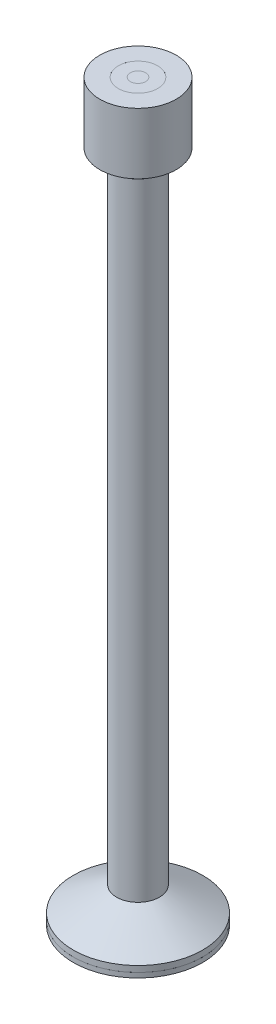
ISO-10303-21;
HEADER;
FILE_DESCRIPTION(('STEP AP214'),'2;1');
FILE_NAME('part.step','',(''),(''),'','','');
FILE_SCHEMA(('AUTOMOTIVE_DESIGN { 1 0 10303 214 1 1 1 1 }'));
ENDSEC;
DATA;
#1=APPLICATION_CONTEXT('core data for automotive mechanical design processes');
#2=APPLICATION_PROTOCOL_DEFINITION('international standard','automotive_design',2000,#1);
#3=PRODUCT_CONTEXT('',#1,'mechanical');
#4=PRODUCT('Part','Part','',(#3));
#5=PRODUCT_RELATED_PRODUCT_CATEGORY('part','',(#4));
#6=PRODUCT_DEFINITION_FORMATION('','',#4);
#7=PRODUCT_DEFINITION_CONTEXT('part definition',#1,'design');
#8=PRODUCT_DEFINITION('design','',#6,#7);
#9=PRODUCT_DEFINITION_SHAPE('','',#8);
#10=(LENGTH_UNIT() NAMED_UNIT(*) SI_UNIT(.MILLI.,.METRE.));
#11=(NAMED_UNIT(*) PLANE_ANGLE_UNIT() SI_UNIT($,.RADIAN.));
#12=(NAMED_UNIT(*) SI_UNIT($,.STERADIAN.) SOLID_ANGLE_UNIT());
#13=UNCERTAINTY_MEASURE_WITH_UNIT(LENGTH_MEASURE(1.E-05),#10,'distance_accuracy_value','');
#14=(GEOMETRIC_REPRESENTATION_CONTEXT(3) GLOBAL_UNCERTAINTY_ASSIGNED_CONTEXT((#13)) GLOBAL_UNIT_ASSIGNED_CONTEXT((#10,
#11,#12)) REPRESENTATION_CONTEXT('',''));
#15=CARTESIAN_POINT('',(0.,0.,0.));
#16=DIRECTION('',(0.,0.,1.));
#17=DIRECTION('',(1.,0.,0.));
#18=AXIS2_PLACEMENT_3D('',#15,#16,#17);
#19=CARTESIAN_POINT('',(1.37500000000001,0.100000000000002,0.));
#20=DIRECTION('',(0.,1.,0.));
#21=DIRECTION('',(0.,0.,1.));
#22=AXIS2_PLACEMENT_3D('',#19,#20,#21);
#23=PLANE('',#22);
#24=CARTESIAN_POINT('',(0.,0.100000000000002,0.));
#25=DIRECTION('',(0.,1.,0.));
#26=DIRECTION('',(0.,0.,1.));
#27=AXIS2_PLACEMENT_3D('',#24,#25,#26);
#28=CIRCLE('',#27,1.37500000000001);
#29=CARTESIAN_POINT('',(0.,0.100000000000002,1.37500000000001));
#30=VERTEX_POINT('',#29);
#31=EDGE_CURVE('E11',#30,#30,#28,.F.);
#32=ORIENTED_EDGE('',*,*,#31,.F.);
#33=EDGE_LOOP('',(#32));
#34=FACE_BOUND('',#33,.T.);
#35=ADVANCED_FACE('F42',(#34),#23,.T.);
#36=CARTESIAN_POINT('',(0.,3.98908729652604,0.));
#37=DIRECTION('',(0.,-1.,0.));
#38=DIRECTION('',(1.,0.,0.));
#39=AXIS2_PLACEMENT_3D('',#36,#37,#38);
#40=CYLINDRICAL_SURFACE('',#39,1.37500000000001);
#41=CARTESIAN_POINT('',(0.,0.,0.));
#42=DIRECTION('',(0.,-1.,0.));
#43=DIRECTION('',(1.,0.,0.));
#44=AXIS2_PLACEMENT_3D('',#41,#42,#43);
#45=CIRCLE('',#44,1.37500000000001);
#46=CARTESIAN_POINT('',(1.37500000000001,0.,0.));
#47=VERTEX_POINT('',#46);
#48=EDGE_CURVE('E48',#47,#47,#45,.T.);
#49=ORIENTED_EDGE('',*,*,#48,.F.);
#50=EDGE_LOOP('',(#49));
#51=FACE_BOUND('',#50,.T.);
#52=ORIENTED_EDGE('',*,*,#31,.T.);
#53=EDGE_LOOP('',(#52));
#54=FACE_BOUND('',#53,.T.);
#55=ADVANCED_FACE('F75',(#51,#54),#40,.T.);
#56=CARTESIAN_POINT('',(0.,-0.4,0.));
#57=DIRECTION('',(0.,1.,0.));
#58=DIRECTION('',(-1.,0.,0.));
#59=AXIS2_PLACEMENT_3D('',#56,#57,#58);
#60=CYLINDRICAL_SURFACE('',#59,5.37499999999999);
#61=CARTESIAN_POINT('',(0.,-0.4,0.));
#62=DIRECTION('',(0.,-1.,0.));
#63=DIRECTION('',(1.,0.,0.));
#64=AXIS2_PLACEMENT_3D('',#61,#62,#63);
#65=CIRCLE('',#64,5.37499999999999);
#66=CARTESIAN_POINT('',(5.375,-0.4,0.));
#67=VERTEX_POINT('',#66);
#68=EDGE_CURVE('E52',#67,#67,#65,.T.);
#69=ORIENTED_EDGE('',*,*,#68,.F.);
#70=EDGE_LOOP('',(#69));
#71=FACE_BOUND('',#70,.T.);
#72=CARTESIAN_POINT('',(0.,0.,0.));
#73=DIRECTION('',(0.,-1.,0.));
#74=DIRECTION('',(1.,0.,0.));
#75=AXIS2_PLACEMENT_3D('',#72,#73,#74);
#76=CIRCLE('',#75,5.37499999999999);
#77=CARTESIAN_POINT('',(5.375,0.,0.));
#78=VERTEX_POINT('',#77);
#79=EDGE_CURVE('E56',#78,#78,#76,.T.);
#80=ORIENTED_EDGE('',*,*,#79,.T.);
#81=EDGE_LOOP('',(#80));
#82=FACE_BOUND('',#81,.T.);
#83=ADVANCED_FACE('F62',(#71,#82),#60,.T.);
#84=CARTESIAN_POINT('',(0.,-0.4,0.));
#85=DIRECTION('',(0.,-1.,0.));
#86=DIRECTION('',(1.,0.,0.));
#87=AXIS2_PLACEMENT_3D('',#84,#85,#86);
#88=PLANE('',#87);
#89=ORIENTED_EDGE('',*,*,#68,.T.);
#90=EDGE_LOOP('',(#89));
#91=FACE_BOUND('',#90,.T.);
#92=ADVANCED_FACE('F66',(#91),#88,.T.);
#93=CARTESIAN_POINT('',(0.,0.,0.));
#94=DIRECTION('',(0.,-1.,0.));
#95=DIRECTION('',(1.,0.,0.));
#96=AXIS2_PLACEMENT_3D('',#93,#94,#95);
#97=PLANE('',#96);
#98=ORIENTED_EDGE('',*,*,#48,.T.);
#99=EDGE_LOOP('',(#98));
#100=FACE_BOUND('',#99,.T.);
#101=ORIENTED_EDGE('',*,*,#79,.F.);
#102=EDGE_LOOP('',(#101));
#103=FACE_BOUND('',#102,.T.);
#104=ADVANCED_FACE('F64',(#100,#103),#97,.F.);
#105=CLOSED_SHELL('',(#35,#55,#83,#92,#104));
#106=MANIFOLD_SOLID_BREP('B2',#105);
#107=CARTESIAN_POINT('',(0.,55.5,0.));
#108=DIRECTION('',(0.,1.,0.));
#109=DIRECTION('',(0.,0.,1.));
#110=AXIS2_PLACEMENT_3D('',#107,#108,#109);
#111=CYLINDRICAL_SURFACE('',#110,0.375);
#112=CARTESIAN_POINT('',(0.,0.100000000000003,0.));
#113=DIRECTION('',(0.,1.,0.));
#114=DIRECTION('',(0.,0.,1.));
#115=AXIS2_PLACEMENT_3D('',#112,#113,#114);
#116=CIRCLE('',#115,0.375);
#117=CARTESIAN_POINT('',(0.,0.100000000000003,0.375));
#118=VERTEX_POINT('',#117);
#119=EDGE_CURVE('E142',#118,#118,#116,.T.);
#120=ORIENTED_EDGE('',*,*,#119,.F.);
#121=EDGE_LOOP('',(#120));
#122=FACE_BOUND('',#121,.T.);
#123=CARTESIAN_POINT('',(0.,54.9421933085502,0.));
#124=DIRECTION('',(0.,1.,0.));
#125=DIRECTION('',(0.,0.,1.));
#126=AXIS2_PLACEMENT_3D('',#123,#124,#125);
#127=CIRCLE('',#126,0.375);
#128=CARTESIAN_POINT('',(0.,54.9421933085502,0.375));
#129=VERTEX_POINT('',#128);
#130=EDGE_CURVE('E41',#129,#129,#127,.T.);
#131=ORIENTED_EDGE('',*,*,#130,.T.);
#132=EDGE_LOOP('',(#131));
#133=FACE_BOUND('',#132,.T.);
#134=ADVANCED_FACE('F120',(#122,#133),#111,.F.);
#135=CARTESIAN_POINT('',(0.,60.571,0.));
#136=DIRECTION('',(0.,1.,0.));
#137=DIRECTION('',(0.,0.,1.));
#138=AXIS2_PLACEMENT_3D('',#135,#136,#137);
#139=CONICAL_SURFACE('',#138,0.635000000000092,0.0461581536129454);
#140=ORIENTED_EDGE('',*,*,#130,.F.);
#141=EDGE_LOOP('',(#140));
#142=FACE_BOUND('',#141,.T.);
#143=CARTESIAN_POINT('',(0.,60.571,0.));
#144=DIRECTION('',(0.,1.,0.));
#145=DIRECTION('',(0.,0.,1.));
#146=AXIS2_PLACEMENT_3D('',#143,#144,#145);
#147=CIRCLE('',#146,0.635000000000092);
#148=CARTESIAN_POINT('',(0.,60.571,0.635000000000092));
#149=VERTEX_POINT('',#148);
#150=EDGE_CURVE('E126',#149,#149,#147,.T.);
#151=ORIENTED_EDGE('',*,*,#150,.T.);
#152=EDGE_LOOP('',(#151));
#153=FACE_BOUND('',#152,.T.);
#154=ADVANCED_FACE('F149',(#142,#153),#139,.F.);
#155=CARTESIAN_POINT('',(0.635000000000092,60.571,0.));
#156=DIRECTION('',(0.,-1.,0.));
#157=DIRECTION('',(0.,0.,-1.));
#158=AXIS2_PLACEMENT_3D('',#155,#156,#157);
#159=PLANE('',#158);
#160=ORIENTED_EDGE('',*,*,#150,.F.);
#161=EDGE_LOOP('',(#160));
#162=FACE_BOUND('',#161,.T.);
#163=CARTESIAN_POINT('',(0.,60.571,0.));
#164=DIRECTION('',(0.,1.,0.));
#165=DIRECTION('',(0.,0.,1.));
#166=AXIS2_PLACEMENT_3D('',#163,#164,#165);
#167=CIRCLE('',#166,1.63500000000009);
#168=CARTESIAN_POINT('',(0.,60.571,1.63500000000009));
#169=VERTEX_POINT('',#168);
#170=EDGE_CURVE('E130',#169,#169,#167,.T.);
#171=ORIENTED_EDGE('',*,*,#170,.T.);
#172=EDGE_LOOP('',(#171));
#173=FACE_BOUND('',#172,.T.);
#174=ADVANCED_FACE('F153',(#162,#173),#159,.F.);
#175=CARTESIAN_POINT('',(0.,54.9421933085502,0.));
#176=DIRECTION('',(0.,1.,0.));
#177=DIRECTION('',(0.,0.,1.));
#178=AXIS2_PLACEMENT_3D('',#175,#176,#177);
#179=CONICAL_SURFACE('',#178,1.37500000000001,0.0461581536129434);
#180=ORIENTED_EDGE('',*,*,#170,.F.);
#181=EDGE_LOOP('',(#180));
#182=FACE_BOUND('',#181,.T.);
#183=CARTESIAN_POINT('',(0.,54.9421933085502,0.));
#184=DIRECTION('',(0.,1.,0.));
#185=DIRECTION('',(0.,0.,1.));
#186=AXIS2_PLACEMENT_3D('',#183,#184,#185);
#187=CIRCLE('',#186,1.37500000000001);
#188=CARTESIAN_POINT('',(0.,54.9421933085502,1.37500000000001));
#189=VERTEX_POINT('',#188);
#190=EDGE_CURVE('E134',#189,#189,#187,.T.);
#191=ORIENTED_EDGE('',*,*,#190,.T.);
#192=EDGE_LOOP('',(#191));
#193=FACE_BOUND('',#192,.T.);
#194=ADVANCED_FACE('F158',(#182,#193),#179,.T.);
#195=CARTESIAN_POINT('',(0.,55.5,0.));
#196=DIRECTION('',(0.,1.,0.));
#197=DIRECTION('',(0.,0.,1.));
#198=AXIS2_PLACEMENT_3D('',#195,#196,#197);
#199=CYLINDRICAL_SURFACE('',#198,1.37500000000001);
#200=ORIENTED_EDGE('',*,*,#190,.F.);
#201=EDGE_LOOP('',(#200));
#202=FACE_BOUND('',#201,.T.);
#203=CARTESIAN_POINT('',(0.,0.100000000000003,0.));
#204=DIRECTION('',(0.,1.,0.));
#205=DIRECTION('',(0.,0.,1.));
#206=AXIS2_PLACEMENT_3D('',#203,#204,#205);
#207=CIRCLE('',#206,1.37500000000001);
#208=CARTESIAN_POINT('',(0.,0.100000000000003,1.37500000000001));
#209=VERTEX_POINT('',#208);
#210=EDGE_CURVE('E139',#209,#209,#207,.T.);
#211=ORIENTED_EDGE('',*,*,#210,.T.);
#212=EDGE_LOOP('',(#211));
#213=FACE_BOUND('',#212,.T.);
#214=ADVANCED_FACE('F164',(#202,#213),#199,.T.);
#215=CARTESIAN_POINT('',(1.37500000000001,0.100000000000002,0.));
#216=DIRECTION('',(0.,1.,0.));
#217=DIRECTION('',(0.,0.,1.));
#218=AXIS2_PLACEMENT_3D('',#215,#216,#217);
#219=PLANE('',#218);
#220=ORIENTED_EDGE('',*,*,#210,.F.);
#221=EDGE_LOOP('',(#220));
#222=FACE_BOUND('',#221,.T.);
#223=ORIENTED_EDGE('',*,*,#119,.T.);
#224=EDGE_LOOP('',(#223));
#225=FACE_BOUND('',#224,.T.);
#226=ADVANCED_FACE('F146',(#222,#225),#219,.F.);
#227=CLOSED_SHELL('',(#134,#154,#174,#194,#214,#226));
#228=MANIFOLD_SOLID_BREP('B6',#227);
#229=CARTESIAN_POINT('',(1.37500000000001,0.,0.));
#230=DIRECTION('',(0.,1.,0.));
#231=DIRECTION('',(-1.,0.,0.));
#232=AXIS2_PLACEMENT_3D('',#229,#230,#231);
#233=PLANE('',#232);
#234=CARTESIAN_POINT('',(0.,0.,0.));
#235=DIRECTION('',(0.,1.,0.));
#236=DIRECTION('',(-1.,0.,0.));
#237=AXIS2_PLACEMENT_3D('',#234,#235,#236);
#238=CIRCLE('',#237,5.37499999999999);
#239=CARTESIAN_POINT('',(-5.37499999999999,0.,0.));
#240=VERTEX_POINT('',#239);
#241=EDGE_CURVE('E119',#240,#240,#238,.T.);
#242=ORIENTED_EDGE('',*,*,#241,.F.);
#243=EDGE_LOOP('',(#242));
#244=FACE_BOUND('',#243,.T.);
#245=CARTESIAN_POINT('',(0.,0.,0.));
#246=DIRECTION('',(0.,1.,0.));
#247=DIRECTION('',(-1.,0.,0.));
#248=AXIS2_PLACEMENT_3D('',#245,#246,#247);
#249=CIRCLE('',#248,1.375);
#250=CARTESIAN_POINT('',(-1.37499999999999,0.,0.));
#251=VERTEX_POINT('',#250);
#252=EDGE_CURVE('E249',#251,#251,#249,.T.);
#253=ORIENTED_EDGE('',*,*,#252,.T.);
#254=EDGE_LOOP('',(#253));
#255=FACE_BOUND('',#254,.T.);
#256=ADVANCED_FACE('F218',(#244,#255),#233,.F.);
#257=CARTESIAN_POINT('',(0.,60.571,0.));
#258=DIRECTION('',(0.,1.,0.));
#259=DIRECTION('',(-1.,0.,0.));
#260=AXIS2_PLACEMENT_3D('',#257,#258,#259);
#261=CYLINDRICAL_SURFACE('',#260,5.37499999999999);
#262=CARTESIAN_POINT('',(0.,0.5,0.));
#263=DIRECTION('',(0.,1.,0.));
#264=DIRECTION('',(-1.,0.,0.));
#265=AXIS2_PLACEMENT_3D('',#262,#263,#264);
#266=CIRCLE('',#265,5.37499999999999);
#267=CARTESIAN_POINT('',(5.375,0.500000000000001,0.));
#268=VERTEX_POINT('',#267);
#269=EDGE_CURVE('E224',#268,#268,#266,.T.);
#270=ORIENTED_EDGE('',*,*,#269,.F.);
#271=EDGE_LOOP('',(#270));
#272=FACE_BOUND('',#271,.T.);
#273=ORIENTED_EDGE('',*,*,#241,.T.);
#274=EDGE_LOOP('',(#273));
#275=FACE_BOUND('',#274,.T.);
#276=ADVANCED_FACE('F292',(#272,#275),#261,.T.);
#277=CARTESIAN_POINT('',(0.,0.5,0.));
#278=DIRECTION('',(0.,-1.,0.));
#279=DIRECTION('',(1.,0.,0.));
#280=AXIS2_PLACEMENT_3D('',#277,#278,#279);
#281=CONICAL_SURFACE('',#280,5.37499999999999,1.06310757338599);
#282=CARTESIAN_POINT('',(0.,2.5,0.));
#283=DIRECTION('',(0.,1.,0.));
#284=DIRECTION('',(-1.,0.,0.));
#285=AXIS2_PLACEMENT_3D('',#282,#283,#284);
#286=CIRCLE('',#285,1.77999999999999);
#287=CARTESIAN_POINT('',(1.78,2.5,0.));
#288=VERTEX_POINT('',#287);
#289=EDGE_CURVE('E228',#288,#288,#286,.T.);
#290=CARTESIAN_POINT('',(1.78,2.5,0.));
#291=CARTESIAN_POINT('',(1.81744791666667,2.47916666666667,0.));
#292=CARTESIAN_POINT('',(1.85489583333333,2.45833333333334,0.));
#293=CARTESIAN_POINT('',(1.92979166666667,2.41666666666667,0.));
#294=CARTESIAN_POINT('',(1.96723958333333,2.39583333333334,0.));
#295=CARTESIAN_POINT('',(2.04213541666667,2.35416666666667,0.));
#296=CARTESIAN_POINT('',(2.07958333333333,2.33333333333334,0.));
#297=CARTESIAN_POINT('',(2.15447916666667,2.29166666666667,0.));
#298=CARTESIAN_POINT('',(2.19192708333333,2.27083333333334,0.));
#299=CARTESIAN_POINT('',(2.26682291666667,2.22916666666667,0.));
#300=CARTESIAN_POINT('',(2.30427083333333,2.20833333333334,0.));
#301=CARTESIAN_POINT('',(2.37916666666667,2.16666666666667,0.));
#302=CARTESIAN_POINT('',(2.41661458333334,2.14583333333334,0.));
#303=CARTESIAN_POINT('',(2.49151041666667,2.10416666666667,0.));
#304=CARTESIAN_POINT('',(2.52895833333333,2.08333333333334,0.));
#305=CARTESIAN_POINT('',(2.60385416666667,2.04166666666667,0.));
#306=CARTESIAN_POINT('',(2.64130208333333,2.02083333333334,0.));
#307=CARTESIAN_POINT('',(2.71619791666667,1.97916666666667,0.));
#308=CARTESIAN_POINT('',(2.75364583333333,1.95833333333334,0.));
#309=CARTESIAN_POINT('',(2.82854166666667,1.91666666666667,0.));
#310=CARTESIAN_POINT('',(2.86598958333333,1.89583333333334,0.));
#311=CARTESIAN_POINT('',(2.94088541666667,1.85416666666667,0.));
#312=CARTESIAN_POINT('',(2.97833333333333,1.83333333333334,0.));
#313=CARTESIAN_POINT('',(3.05322916666667,1.79166666666667,0.));
#314=CARTESIAN_POINT('',(3.09067708333333,1.77083333333334,0.));
#315=CARTESIAN_POINT('',(3.16557291666667,1.72916666666667,0.));
#316=CARTESIAN_POINT('',(3.20302083333333,1.70833333333334,0.));
#317=CARTESIAN_POINT('',(3.27791666666667,1.66666666666667,0.));
#318=CARTESIAN_POINT('',(3.31536458333333,1.64583333333334,0.));
#319=CARTESIAN_POINT('',(3.39026041666667,1.60416666666667,0.));
#320=CARTESIAN_POINT('',(3.42770833333333,1.58333333333334,0.));
#321=CARTESIAN_POINT('',(3.50260416666667,1.54166666666667,0.));
#322=CARTESIAN_POINT('',(3.54005208333333,1.52083333333334,0.));
#323=CARTESIAN_POINT('',(3.61494791666667,1.47916666666667,0.));
#324=CARTESIAN_POINT('',(3.65239583333333,1.45833333333334,0.));
#325=CARTESIAN_POINT('',(3.72729166666667,1.41666666666667,0.));
#326=CARTESIAN_POINT('',(3.76473958333333,1.39583333333334,0.));
#327=CARTESIAN_POINT('',(3.83963541666667,1.35416666666667,0.));
#328=CARTESIAN_POINT('',(3.87708333333333,1.33333333333334,0.));
#329=CARTESIAN_POINT('',(3.95197916666667,1.29166666666667,0.));
#330=CARTESIAN_POINT('',(3.98942708333333,1.27083333333334,0.));
#331=CARTESIAN_POINT('',(4.06432291666667,1.22916666666667,0.));
#332=CARTESIAN_POINT('',(4.10177083333333,1.20833333333333,0.));
#333=CARTESIAN_POINT('',(4.17666666666667,1.16666666666667,0.));
#334=CARTESIAN_POINT('',(4.21411458333333,1.14583333333333,0.));
#335=CARTESIAN_POINT('',(4.28901041666667,1.10416666666667,0.));
#336=CARTESIAN_POINT('',(4.32645833333333,1.08333333333333,0.));
#337=CARTESIAN_POINT('',(4.40135416666667,1.04166666666667,0.));
#338=CARTESIAN_POINT('',(4.43880208333333,1.02083333333333,0.));
#339=CARTESIAN_POINT('',(4.51369791666667,0.979166666666668,0.));
#340=CARTESIAN_POINT('',(4.55114583333333,0.958333333333335,0.));
#341=CARTESIAN_POINT('',(4.62604166666667,0.916666666666668,0.));
#342=CARTESIAN_POINT('',(4.66348958333333,0.895833333333335,0.));
#343=CARTESIAN_POINT('',(4.73838541666667,0.854166666666668,0.));
#344=CARTESIAN_POINT('',(4.77583333333333,0.833333333333335,0.));
#345=CARTESIAN_POINT('',(4.85072916666667,0.791666666666668,0.));
#346=CARTESIAN_POINT('',(4.88817708333333,0.770833333333334,0.));
#347=CARTESIAN_POINT('',(4.96307291666667,0.729166666666668,0.));
#348=CARTESIAN_POINT('',(5.00052083333333,0.708333333333335,0.));
#349=CARTESIAN_POINT('',(5.07541666666667,0.666666666666668,0.));
#350=CARTESIAN_POINT('',(5.11286458333333,0.645833333333334,0.));
#351=CARTESIAN_POINT('',(5.18776041666667,0.604166666666668,0.));
#352=CARTESIAN_POINT('',(5.22520833333333,0.583333333333334,0.));
#353=CARTESIAN_POINT('',(5.30010416666667,0.541666666666668,0.));
#354=CARTESIAN_POINT('',(5.33755208333333,0.520833333333335,0.));
#355=CARTESIAN_POINT('',(5.375,0.500000000000001,0.));
#356=B_SPLINE_CURVE_WITH_KNOTS('',3,(#290,#291,#292,#293,#294,#295,#296,#297,#298,#299,#300,
#301,#302,#303,#304,#305,#306,#307,#308,#309,#310,#311,#312,#313,#314,#315,#316,#317,#318,#319,
#320,#321,#322,#323,#324,#325,#326,#327,#328,#329,#330,#331,#332,#333,#334,#335,#336,#337,#338,
#339,#340,#341,#342,#343,#344,#345,#346,#347,#348,#349,#350,#351,#352,#353,#354,#355),
.UNSPECIFIED.,.F.,.F.,(4,2,2,2,2,2,2,2,2,2,2,2,2,2,2,2,2,2,2,2,2,2,2,2,2,2,2,2,2,2,2,2,4),(0.,
0.128558812082496,0.257117624164992,0.385676436247487,0.514235248329984,0.64279406041248,
0.771352872494976,0.899911684577471,1.02847049665997,1.15702930874246,1.28558812082496,
1.41414693290746,1.54270574498995,1.67126455707245,1.79982336915494,1.92838218123744,
2.05694099331994,2.18549980540243,2.31405861748493,2.44261742956742,2.57117624164992,
2.69973505373241,2.82829386581491,2.9568526778974,3.0854114899799,3.2139703020624,
3.34252911414489,3.47108792622739,3.59964673830988,3.72820555039238,3.85676436247488,
3.98532317455737,4.11388198663987),.UNSPECIFIED.);
#357=EDGE_CURVE('BSEAM287',#288,#268,#356,.T.);
#358=ORIENTED_EDGE('',*,*,#289,.F.);
#359=ORIENTED_EDGE('',*,*,#269,.T.);
#360=ORIENTED_EDGE('',*,*,#357,.T.);
#361=ORIENTED_EDGE('',*,*,#357,.F.);
#362=EDGE_LOOP('',(#358,#360,#359,#361));
#363=FACE_BOUND('',#362,.T.);
#364=ADVANCED_FACE('F287',(#363),#281,.T.);
#365=CARTESIAN_POINT('',(0.,60.571,0.));
#366=DIRECTION('',(0.,1.,0.));
#367=DIRECTION('',(-1.,0.,0.));
#368=AXIS2_PLACEMENT_3D('',#365,#366,#367);
#369=CYLINDRICAL_SURFACE('',#368,1.78);
#370=CARTESIAN_POINT('',(0.,54.5,0.));
#371=DIRECTION('',(0.,1.,0.));
#372=DIRECTION('',(-1.,0.,0.));
#373=AXIS2_PLACEMENT_3D('',#370,#371,#372);
#374=CIRCLE('',#373,1.78);
#375=CARTESIAN_POINT('',(-1.78,54.5,0.));
#376=VERTEX_POINT('',#375);
#377=EDGE_CURVE('E232',#376,#376,#374,.T.);
#378=ORIENTED_EDGE('',*,*,#377,.F.);
#379=EDGE_LOOP('',(#378));
#380=FACE_BOUND('',#379,.T.);
#381=ORIENTED_EDGE('',*,*,#289,.T.);
#382=EDGE_LOOP('',(#381));
#383=FACE_BOUND('',#382,.T.);
#384=ADVANCED_FACE('F281',(#380,#383),#369,.T.);
#385=CARTESIAN_POINT('',(0.,54.5,0.));
#386=DIRECTION('',(0.,1.,0.));
#387=DIRECTION('',(-1.,0.,0.));
#388=AXIS2_PLACEMENT_3D('',#385,#386,#387);
#389=CONICAL_SURFACE('',#388,1.78,0.947760988153379);
#390=CARTESIAN_POINT('',(0.,55.5,0.));
#391=DIRECTION('',(0.,1.,0.));
#392=DIRECTION('',(-1.,0.,0.));
#393=AXIS2_PLACEMENT_3D('',#390,#391,#392);
#394=CIRCLE('',#393,3.17178589149484);
#395=CARTESIAN_POINT('',(-3.17178589149484,55.5,0.));
#396=VERTEX_POINT('',#395);
#397=EDGE_CURVE('E237',#396,#396,#394,.T.);
#398=ORIENTED_EDGE('',*,*,#397,.F.);
#399=EDGE_LOOP('',(#398));
#400=FACE_BOUND('',#399,.T.);
#401=ORIENTED_EDGE('',*,*,#377,.T.);
#402=EDGE_LOOP('',(#401));
#403=FACE_BOUND('',#402,.T.);
#404=ADVANCED_FACE('F275',(#400,#403),#389,.T.);
#405=CARTESIAN_POINT('',(0.,60.571,0.));
#406=DIRECTION('',(0.,1.,0.));
#407=DIRECTION('',(-1.,0.,0.));
#408=AXIS2_PLACEMENT_3D('',#405,#406,#407);
#409=CYLINDRICAL_SURFACE('',#408,3.17178589149484);
#410=CARTESIAN_POINT('',(0.,60.571,0.));
#411=DIRECTION('',(0.,1.,0.));
#412=DIRECTION('',(-1.,0.,0.));
#413=AXIS2_PLACEMENT_3D('',#410,#411,#412);
#414=CIRCLE('',#413,3.17178589149484);
#415=CARTESIAN_POINT('',(-3.17178589149484,60.571,0.));
#416=VERTEX_POINT('',#415);
#417=EDGE_CURVE('E240',#416,#416,#414,.T.);
#418=ORIENTED_EDGE('',*,*,#417,.F.);
#419=EDGE_LOOP('',(#418));
#420=FACE_BOUND('',#419,.T.);
#421=ORIENTED_EDGE('',*,*,#397,.T.);
#422=EDGE_LOOP('',(#421));
#423=FACE_BOUND('',#422,.T.);
#424=ADVANCED_FACE('F269',(#420,#423),#409,.T.);
#425=CARTESIAN_POINT('',(3.17178589149484,60.571,0.));
#426=DIRECTION('',(0.,-1.,0.));
#427=DIRECTION('',(1.,0.,0.));
#428=AXIS2_PLACEMENT_3D('',#425,#426,#427);
#429=PLANE('',#428);
#430=CARTESIAN_POINT('',(0.,60.571,0.));
#431=DIRECTION('',(0.,1.,0.));
#432=DIRECTION('',(-1.,0.,0.));
#433=AXIS2_PLACEMENT_3D('',#430,#431,#432);
#434=CIRCLE('',#433,1.63500000000009);
#435=CARTESIAN_POINT('',(-1.63500000000009,60.571,0.));
#436=VERTEX_POINT('',#435);
#437=EDGE_CURVE('E243',#436,#436,#434,.T.);
#438=ORIENTED_EDGE('',*,*,#437,.F.);
#439=EDGE_LOOP('',(#438));
#440=FACE_BOUND('',#439,.T.);
#441=ORIENTED_EDGE('',*,*,#417,.T.);
#442=EDGE_LOOP('',(#441));
#443=FACE_BOUND('',#442,.T.);
#444=ADVANCED_FACE('F263',(#440,#443),#429,.F.);
#445=CARTESIAN_POINT('',(0.,60.571,0.));
#446=DIRECTION('',(0.,1.,0.));
#447=DIRECTION('',(-1.,0.,0.));
#448=AXIS2_PLACEMENT_3D('',#445,#446,#447);
#449=CONICAL_SURFACE('',#448,1.63500000000009,0.0461581536129435);
#450=CARTESIAN_POINT('',(0.,54.9421933085502,0.));
#451=DIRECTION('',(0.,1.,0.));
#452=DIRECTION('',(-1.,0.,0.));
#453=AXIS2_PLACEMENT_3D('',#450,#451,#452);
#454=CIRCLE('',#453,1.37500000000001);
#455=CARTESIAN_POINT('',(-1.37500000000001,54.9421933085502,0.));
#456=VERTEX_POINT('',#455);
#457=EDGE_CURVE('E246',#456,#456,#454,.T.);
#458=ORIENTED_EDGE('',*,*,#457,.F.);
#459=EDGE_LOOP('',(#458));
#460=FACE_BOUND('',#459,.T.);
#461=ORIENTED_EDGE('',*,*,#437,.T.);
#462=EDGE_LOOP('',(#461));
#463=FACE_BOUND('',#462,.T.);
#464=ADVANCED_FACE('F257',(#460,#463),#449,.F.);
#465=CARTESIAN_POINT('',(0.,60.571,0.));
#466=DIRECTION('',(0.,1.,0.));
#467=DIRECTION('',(-1.,0.,0.));
#468=AXIS2_PLACEMENT_3D('',#465,#466,#467);
#469=CYLINDRICAL_SURFACE('',#468,1.375);
#470=ORIENTED_EDGE('',*,*,#252,.F.);
#471=EDGE_LOOP('',(#470));
#472=FACE_BOUND('',#471,.T.);
#473=ORIENTED_EDGE('',*,*,#457,.T.);
#474=EDGE_LOOP('',(#473));
#475=FACE_BOUND('',#474,.T.);
#476=ADVANCED_FACE('F254',(#472,#475),#469,.F.);
#477=CLOSED_SHELL('',(#256,#276,#364,#384,#404,#424,#444,#464,#476));
#478=MANIFOLD_SOLID_BREP('B36',#477);
#479=CARTESIAN_POINT('',(0.63500000000009,60.571,0.));
#480=DIRECTION('',(0.,-1.,0.));
#481=DIRECTION('',(1.,0.,0.));
#482=AXIS2_PLACEMENT_3D('',#479,#480,#481);
#483=PLANE('',#482);
#484=CARTESIAN_POINT('',(0.,60.571,0.));
#485=DIRECTION('',(0.,1.,0.));
#486=DIRECTION('',(-1.,0.,0.));
#487=AXIS2_PLACEMENT_3D('',#484,#485,#486);
#488=CIRCLE('',#487,0.63500000000009);
#489=CARTESIAN_POINT('',(-0.63500000000009,60.571,0.));
#490=VERTEX_POINT('',#489);
#491=EDGE_CURVE('E217',#490,#490,#488,.T.);
#492=ORIENTED_EDGE('',*,*,#491,.T.);
#493=EDGE_LOOP('',(#492));
#494=FACE_BOUND('',#493,.T.);
#495=ADVANCED_FACE('F358',(#494),#483,.F.);
#496=CARTESIAN_POINT('',(0.,54.9421933085502,0.));
#497=DIRECTION('',(0.,1.,0.));
#498=DIRECTION('',(-1.,0.,0.));
#499=AXIS2_PLACEMENT_3D('',#496,#497,#498);
#500=CONICAL_SURFACE('',#499,0.374999999999999,0.0461581536129452);
#501=ORIENTED_EDGE('',*,*,#491,.F.);
#502=EDGE_LOOP('',(#501));
#503=FACE_BOUND('',#502,.T.);
#504=CARTESIAN_POINT('',(0.,54.9421933085502,0.));
#505=DIRECTION('',(0.,1.,0.));
#506=DIRECTION('',(-1.,0.,0.));
#507=AXIS2_PLACEMENT_3D('',#504,#505,#506);
#508=CIRCLE('',#507,0.374999999999999);
#509=CARTESIAN_POINT('',(-0.374999999999999,54.9421933085502,0.));
#510=VERTEX_POINT('',#509);
#511=EDGE_CURVE('E364',#510,#510,#508,.T.);
#512=ORIENTED_EDGE('',*,*,#511,.T.);
#513=EDGE_LOOP('',(#512));
#514=FACE_BOUND('',#513,.T.);
#515=ADVANCED_FACE('F383',(#503,#514),#500,.T.);
#516=CARTESIAN_POINT('',(0.,60.571,0.));
#517=DIRECTION('',(0.,1.,0.));
#518=DIRECTION('',(-1.,0.,0.));
#519=AXIS2_PLACEMENT_3D('',#516,#517,#518);
#520=CYLINDRICAL_SURFACE('',#519,0.374999999999996);
#521=ORIENTED_EDGE('',*,*,#511,.F.);
#522=EDGE_LOOP('',(#521));
#523=FACE_BOUND('',#522,.T.);
#524=CARTESIAN_POINT('',(0.,0.100000000000003,0.));
#525=DIRECTION('',(0.,1.,0.));
#526=DIRECTION('',(-1.,0.,0.));
#527=AXIS2_PLACEMENT_3D('',#524,#525,#526);
#528=CIRCLE('',#527,0.374999999999993);
#529=CARTESIAN_POINT('',(-0.374999999999985,0.100000000000003,0.));
#530=VERTEX_POINT('',#529);
#531=EDGE_CURVE('E368',#530,#530,#528,.T.);
#532=ORIENTED_EDGE('',*,*,#531,.T.);
#533=EDGE_LOOP('',(#532));
#534=FACE_BOUND('',#533,.T.);
#535=ADVANCED_FACE('F375',(#523,#534),#520,.T.);
#536=CARTESIAN_POINT('',(0.375,0.100000000000002,0.));
#537=DIRECTION('',(0.,1.,0.));
#538=DIRECTION('',(-1.,0.,0.));
#539=AXIS2_PLACEMENT_3D('',#536,#537,#538);
#540=PLANE('',#539);
#541=ORIENTED_EDGE('',*,*,#531,.F.);
#542=EDGE_LOOP('',(#541));
#543=FACE_BOUND('',#542,.T.);
#544=ADVANCED_FACE('F377',(#543),#540,.F.);
#545=CLOSED_SHELL('',(#495,#515,#535,#544));
#546=MANIFOLD_SOLID_BREP('B114',#545);
#547=ADVANCED_BREP_SHAPE_REPRESENTATION('',(#18,#106,#228,#478,#546),#14);
#548=SHAPE_DEFINITION_REPRESENTATION(#9,#547);
ENDSEC;
END-ISO-10303-21;
